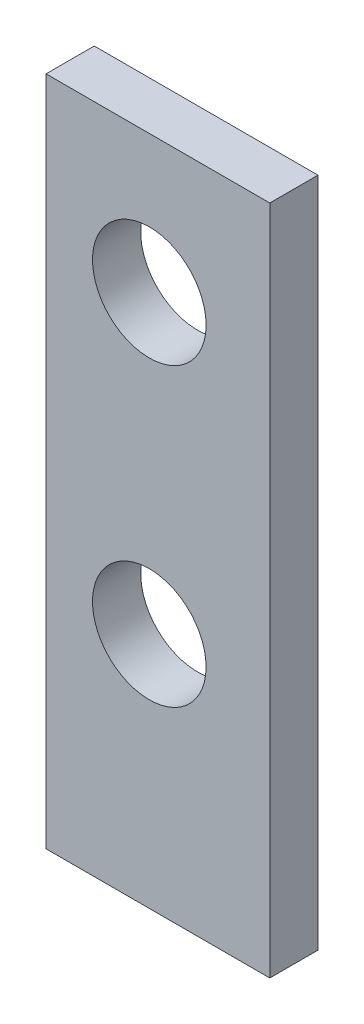
ISO-10303-21;
HEADER;
FILE_DESCRIPTION(('STEP AP214'),'2;1');
FILE_NAME('part.step','',(''),(''),'','','');
FILE_SCHEMA(('AUTOMOTIVE_DESIGN { 1 0 10303 214 1 1 1 1 }'));
ENDSEC;
DATA;
#1=APPLICATION_CONTEXT('core data for automotive mechanical design processes');
#2=APPLICATION_PROTOCOL_DEFINITION('international standard','automotive_design',2000,#1);
#3=PRODUCT_CONTEXT('',#1,'mechanical');
#4=PRODUCT('Part','Part','',(#3));
#5=PRODUCT_RELATED_PRODUCT_CATEGORY('part','',(#4));
#6=PRODUCT_DEFINITION_FORMATION('','',#4);
#7=PRODUCT_DEFINITION_CONTEXT('part definition',#1,'design');
#8=PRODUCT_DEFINITION('design','',#6,#7);
#9=PRODUCT_DEFINITION_SHAPE('','',#8);
#10=(LENGTH_UNIT() NAMED_UNIT(*) SI_UNIT(.MILLI.,.METRE.));
#11=(NAMED_UNIT(*) PLANE_ANGLE_UNIT() SI_UNIT($,.RADIAN.));
#12=(NAMED_UNIT(*) SI_UNIT($,.STERADIAN.) SOLID_ANGLE_UNIT());
#13=UNCERTAINTY_MEASURE_WITH_UNIT(LENGTH_MEASURE(1.E-05),#10,'distance_accuracy_value','');
#14=(GEOMETRIC_REPRESENTATION_CONTEXT(3) GLOBAL_UNCERTAINTY_ASSIGNED_CONTEXT((#13)) GLOBAL_UNIT_ASSIGNED_CONTEXT((#10,
#11,#12)) REPRESENTATION_CONTEXT('',''));
#15=CARTESIAN_POINT('',(0.,0.,0.));
#16=DIRECTION('',(0.,0.,1.));
#17=DIRECTION('',(1.,0.,0.));
#18=AXIS2_PLACEMENT_3D('',#15,#16,#17);
#19=CARTESIAN_POINT('',(0.,0.,1.4));
#20=DIRECTION('',(0.,0.,1.));
#21=DIRECTION('',(1.,0.,0.));
#22=AXIS2_PLACEMENT_3D('',#19,#20,#21);
#23=PLANE('',#22);
#24=CARTESIAN_POINT('',(-37.2,-64.0000000000179,1.4));
#25=DIRECTION('',(0.,0.,1.));
#26=DIRECTION('',(1.,0.,0.));
#27=AXIS2_PLACEMENT_3D('',#24,#25,#26);
#28=CIRCLE('',#27,1.65);
#29=CARTESIAN_POINT('',(-35.55,-64.0000000000179,1.4));
#30=VERTEX_POINT('',#29);
#31=EDGE_CURVE('E102',#30,#30,#28,.T.);
#32=ORIENTED_EDGE('',*,*,#31,.F.);
#33=EDGE_LOOP('',(#32));
#34=FACE_BOUND('',#33,.T.);
#35=DIRECTION('',(0.,1.,0.));
#36=VECTOR('',#35,1.);
#37=CARTESIAN_POINT('',(-33.7,-70.9000000000178,1.4));
#38=LINE('',#37,#36);
#39=CARTESIAN_POINT('',(-33.7,-70.9000000000178,1.4));
#40=VERTEX_POINT('',#39);
#41=CARTESIAN_POINT('',(-33.7,-51.4000000000179,1.4));
#42=VERTEX_POINT('',#41);
#43=EDGE_CURVE('E87',#40,#42,#38,.T.);
#44=ORIENTED_EDGE('',*,*,#43,.T.);
#45=DIRECTION('',(-1.,0.,0.));
#46=VECTOR('',#45,1.);
#47=CARTESIAN_POINT('',(-33.7,-51.4000000000179,1.4));
#48=LINE('',#47,#46);
#49=CARTESIAN_POINT('',(-40.2,-51.4000000000179,1.4));
#50=VERTEX_POINT('',#49);
#51=EDGE_CURVE('E82',#42,#50,#48,.T.);
#52=ORIENTED_EDGE('',*,*,#51,.T.);
#53=DIRECTION('',(0.,-1.,0.));
#54=VECTOR('',#53,1.);
#55=CARTESIAN_POINT('',(-40.2,-70.9000000000178,1.4));
#56=LINE('',#55,#54);
#57=CARTESIAN_POINT('',(-40.2,-70.9000000000178,1.4));
#58=VERTEX_POINT('',#57);
#59=EDGE_CURVE('E85',#50,#58,#56,.T.);
#60=ORIENTED_EDGE('',*,*,#59,.T.);
#61=DIRECTION('',(1.,0.,0.));
#62=VECTOR('',#61,1.);
#63=CARTESIAN_POINT('',(-33.7,-70.9000000000178,1.4));
#64=LINE('',#63,#62);
#65=EDGE_CURVE('E52',#58,#40,#64,.T.);
#66=ORIENTED_EDGE('',*,*,#65,.T.);
#67=EDGE_LOOP('',(#44,#52,#60,#66));
#68=FACE_BOUND('',#67,.T.);
#69=CARTESIAN_POINT('',(-37.2,-55.4000000000179,1.4));
#70=DIRECTION('',(0.,0.,1.));
#71=DIRECTION('',(1.,0.,0.));
#72=AXIS2_PLACEMENT_3D('',#69,#70,#71);
#73=CIRCLE('',#72,1.65);
#74=CARTESIAN_POINT('',(-35.55,-55.4000000000179,1.4));
#75=VERTEX_POINT('',#74);
#76=EDGE_CURVE('E117',#75,#75,#73,.T.);
#77=ORIENTED_EDGE('',*,*,#76,.F.);
#78=EDGE_LOOP('',(#77));
#79=FACE_BOUND('',#78,.T.);
#80=ADVANCED_FACE('F35',(#34,#68,#79),#23,.T.);
#81=CARTESIAN_POINT('',(0.,0.,0.));
#82=DIRECTION('',(0.,0.,1.));
#83=DIRECTION('',(1.,0.,0.));
#84=AXIS2_PLACEMENT_3D('',#81,#82,#83);
#85=PLANE('',#84);
#86=DIRECTION('',(0.,1.,0.));
#87=VECTOR('',#86,1.);
#88=CARTESIAN_POINT('',(-33.7,-70.9000000000178,0.));
#89=LINE('',#88,#87);
#90=CARTESIAN_POINT('',(-33.7,-70.9000000000178,0.));
#91=VERTEX_POINT('',#90);
#92=CARTESIAN_POINT('',(-33.7,-51.4000000000179,0.));
#93=VERTEX_POINT('',#92);
#94=EDGE_CURVE('E99',#91,#93,#89,.T.);
#95=ORIENTED_EDGE('',*,*,#94,.F.);
#96=DIRECTION('',(1.,0.,0.));
#97=VECTOR('',#96,1.);
#98=CARTESIAN_POINT('',(-33.7,-70.9000000000178,0.));
#99=LINE('',#98,#97);
#100=CARTESIAN_POINT('',(-40.2,-70.9000000000178,0.));
#101=VERTEX_POINT('',#100);
#102=EDGE_CURVE('E75',#101,#91,#99,.T.);
#103=ORIENTED_EDGE('',*,*,#102,.F.);
#104=DIRECTION('',(0.,-1.,0.));
#105=VECTOR('',#104,1.);
#106=CARTESIAN_POINT('',(-40.2,-70.9000000000178,0.));
#107=LINE('',#106,#105);
#108=CARTESIAN_POINT('',(-40.2,-51.4000000000179,0.));
#109=VERTEX_POINT('',#108);
#110=EDGE_CURVE('E69',#109,#101,#107,.T.);
#111=ORIENTED_EDGE('',*,*,#110,.F.);
#112=DIRECTION('',(-1.,0.,0.));
#113=VECTOR('',#112,1.);
#114=CARTESIAN_POINT('',(-33.7,-51.4000000000179,0.));
#115=LINE('',#114,#113);
#116=EDGE_CURVE('E91',#93,#109,#115,.T.);
#117=ORIENTED_EDGE('',*,*,#116,.F.);
#118=EDGE_LOOP('',(#95,#103,#111,#117));
#119=FACE_BOUND('',#118,.T.);
#120=CARTESIAN_POINT('',(-37.2,-64.0000000000179,0.));
#121=DIRECTION('',(0.,0.,1.));
#122=DIRECTION('',(1.,0.,0.));
#123=AXIS2_PLACEMENT_3D('',#120,#121,#122);
#124=CIRCLE('',#123,1.65);
#125=CARTESIAN_POINT('',(-35.55,-64.0000000000179,0.));
#126=VERTEX_POINT('',#125);
#127=EDGE_CURVE('E114',#126,#126,#124,.T.);
#128=ORIENTED_EDGE('',*,*,#127,.T.);
#129=EDGE_LOOP('',(#128));
#130=FACE_BOUND('',#129,.T.);
#131=CARTESIAN_POINT('',(-37.2,-55.4000000000179,0.));
#132=DIRECTION('',(0.,0.,1.));
#133=DIRECTION('',(1.,0.,0.));
#134=AXIS2_PLACEMENT_3D('',#131,#132,#133);
#135=CIRCLE('',#134,1.65);
#136=CARTESIAN_POINT('',(-35.55,-55.4000000000179,0.));
#137=VERTEX_POINT('',#136);
#138=EDGE_CURVE('E120',#137,#137,#135,.T.);
#139=ORIENTED_EDGE('',*,*,#138,.T.);
#140=EDGE_LOOP('',(#139));
#141=FACE_BOUND('',#140,.T.);
#142=ADVANCED_FACE('F110',(#119,#130,#141),#85,.F.);
#143=CARTESIAN_POINT('',(-33.7,-70.9000000000178,1.4));
#144=DIRECTION('',(-1.,0.,0.));
#145=DIRECTION('',(0.,0.,1.));
#146=AXIS2_PLACEMENT_3D('',#143,#144,#145);
#147=PLANE('',#146);
#148=ORIENTED_EDGE('',*,*,#94,.T.);
#149=DIRECTION('',(0.,0.,-1.));
#150=VECTOR('',#149,1.);
#151=CARTESIAN_POINT('',(-33.7,-51.4000000000179,1.4));
#152=LINE('',#151,#150);
#153=EDGE_CURVE('E11',#42,#93,#152,.T.);
#154=ORIENTED_EDGE('',*,*,#153,.F.);
#155=ORIENTED_EDGE('',*,*,#43,.F.);
#156=DIRECTION('',(0.,0.,-1.));
#157=VECTOR('',#156,1.);
#158=CARTESIAN_POINT('',(-33.7,-70.9000000000178,1.4));
#159=LINE('',#158,#157);
#160=EDGE_CURVE('E95',#40,#91,#159,.T.);
#161=ORIENTED_EDGE('',*,*,#160,.T.);
#162=EDGE_LOOP('',(#148,#154,#155,#161));
#163=FACE_BOUND('',#162,.T.);
#164=ADVANCED_FACE('F37',(#163),#147,.F.);
#165=CARTESIAN_POINT('',(-33.7,-51.4000000000179,1.4));
#166=DIRECTION('',(0.,-1.,0.));
#167=DIRECTION('',(0.,0.,-1.));
#168=AXIS2_PLACEMENT_3D('',#165,#166,#167);
#169=PLANE('',#168);
#170=ORIENTED_EDGE('',*,*,#116,.T.);
#171=DIRECTION('',(0.,0.,-1.));
#172=VECTOR('',#171,1.);
#173=CARTESIAN_POINT('',(-40.2,-51.4000000000179,1.4));
#174=LINE('',#173,#172);
#175=EDGE_CURVE('E44',#50,#109,#174,.T.);
#176=ORIENTED_EDGE('',*,*,#175,.F.);
#177=ORIENTED_EDGE('',*,*,#51,.F.);
#178=ORIENTED_EDGE('',*,*,#153,.T.);
#179=EDGE_LOOP('',(#170,#176,#177,#178));
#180=FACE_BOUND('',#179,.T.);
#181=ADVANCED_FACE('F90',(#180),#169,.F.);
#182=CARTESIAN_POINT('',(-40.2,-70.9000000000178,1.4));
#183=DIRECTION('',(1.,0.,0.));
#184=DIRECTION('',(0.,0.,-1.));
#185=AXIS2_PLACEMENT_3D('',#182,#183,#184);
#186=PLANE('',#185);
#187=ORIENTED_EDGE('',*,*,#110,.T.);
#188=DIRECTION('',(0.,0.,-1.));
#189=VECTOR('',#188,1.);
#190=CARTESIAN_POINT('',(-40.2,-70.9000000000178,1.4));
#191=LINE('',#190,#189);
#192=EDGE_CURVE('E92',#58,#101,#191,.T.);
#193=ORIENTED_EDGE('',*,*,#192,.F.);
#194=ORIENTED_EDGE('',*,*,#59,.F.);
#195=ORIENTED_EDGE('',*,*,#175,.T.);
#196=EDGE_LOOP('',(#187,#193,#194,#195));
#197=FACE_BOUND('',#196,.T.);
#198=ADVANCED_FACE('F93',(#197),#186,.F.);
#199=CARTESIAN_POINT('',(-33.7,-70.9000000000178,1.4));
#200=DIRECTION('',(0.,1.,0.));
#201=DIRECTION('',(0.,0.,1.));
#202=AXIS2_PLACEMENT_3D('',#199,#200,#201);
#203=PLANE('',#202);
#204=ORIENTED_EDGE('',*,*,#102,.T.);
#205=ORIENTED_EDGE('',*,*,#160,.F.);
#206=ORIENTED_EDGE('',*,*,#65,.F.);
#207=ORIENTED_EDGE('',*,*,#192,.T.);
#208=EDGE_LOOP('',(#204,#205,#206,#207));
#209=FACE_BOUND('',#208,.T.);
#210=ADVANCED_FACE('F107',(#209),#203,.F.);
#211=CARTESIAN_POINT('',(-37.2,-64.0000000000179,1.4));
#212=DIRECTION('',(0.,0.,-1.));
#213=DIRECTION('',(-1.,0.,0.));
#214=AXIS2_PLACEMENT_3D('',#211,#212,#213);
#215=CYLINDRICAL_SURFACE('',#214,1.65);
#216=ORIENTED_EDGE('',*,*,#31,.T.);
#217=EDGE_LOOP('',(#216));
#218=FACE_BOUND('',#217,.T.);
#219=ORIENTED_EDGE('',*,*,#127,.F.);
#220=EDGE_LOOP('',(#219));
#221=FACE_BOUND('',#220,.T.);
#222=ADVANCED_FACE('F137',(#218,#221),#215,.F.);
#223=CARTESIAN_POINT('',(-37.2,-55.4000000000179,1.4));
#224=DIRECTION('',(0.,0.,-1.));
#225=DIRECTION('',(-1.,0.,0.));
#226=AXIS2_PLACEMENT_3D('',#223,#224,#225);
#227=CYLINDRICAL_SURFACE('',#226,1.65);
#228=ORIENTED_EDGE('',*,*,#76,.T.);
#229=EDGE_LOOP('',(#228));
#230=FACE_BOUND('',#229,.T.);
#231=ORIENTED_EDGE('',*,*,#138,.F.);
#232=EDGE_LOOP('',(#231));
#233=FACE_BOUND('',#232,.T.);
#234=ADVANCED_FACE('F126',(#230,#233),#227,.F.);
#235=CLOSED_SHELL('',(#80,#142,#164,#181,#198,#210,#222,#234));
#236=MANIFOLD_SOLID_BREP('B2',#235);
#237=ADVANCED_BREP_SHAPE_REPRESENTATION('',(#18,#236),#14);
#238=SHAPE_DEFINITION_REPRESENTATION(#9,#237);
ENDSEC;
END-ISO-10303-21;
